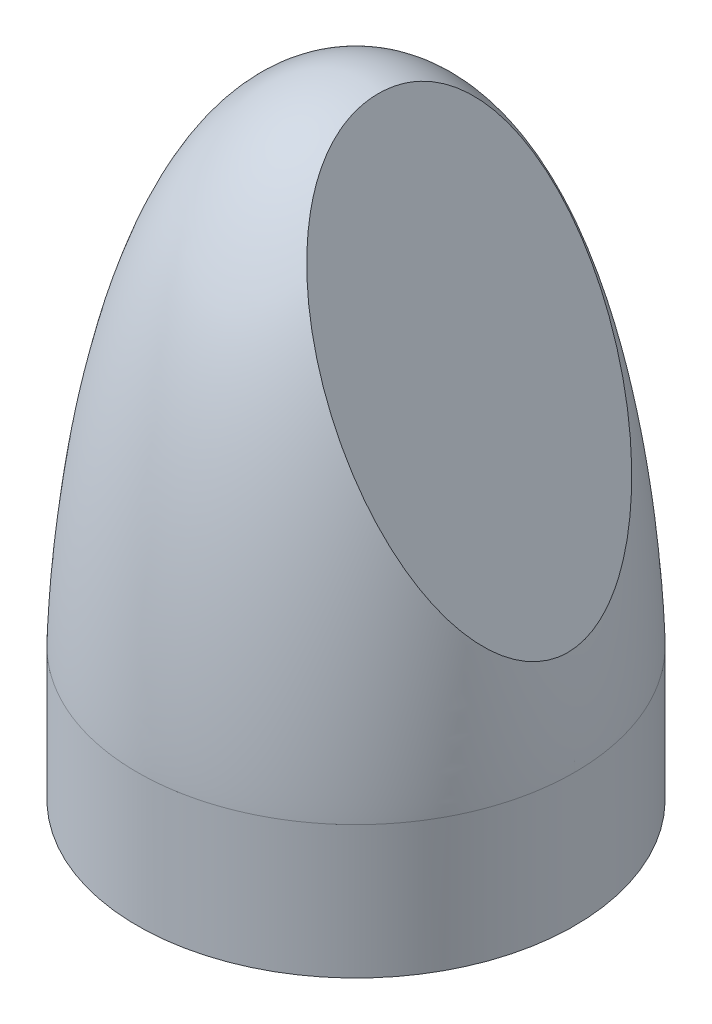
ISO-10303-21;
HEADER;
FILE_DESCRIPTION(('STEP AP214'),'2;1');
FILE_NAME('part.step','',(''),(''),'','','');
FILE_SCHEMA(('AUTOMOTIVE_DESIGN { 1 0 10303 214 1 1 1 1 }'));
ENDSEC;
DATA;
#1=APPLICATION_CONTEXT('core data for automotive mechanical design processes');
#2=APPLICATION_PROTOCOL_DEFINITION('international standard','automotive_design',2000,#1);
#3=PRODUCT_CONTEXT('',#1,'mechanical');
#4=PRODUCT('Part','Part','',(#3));
#5=PRODUCT_RELATED_PRODUCT_CATEGORY('part','',(#4));
#6=PRODUCT_DEFINITION_FORMATION('','',#4);
#7=PRODUCT_DEFINITION_CONTEXT('part definition',#1,'design');
#8=PRODUCT_DEFINITION('design','',#6,#7);
#9=PRODUCT_DEFINITION_SHAPE('','',#8);
#10=(LENGTH_UNIT() NAMED_UNIT(*) SI_UNIT(.MILLI.,.METRE.));
#11=(NAMED_UNIT(*) PLANE_ANGLE_UNIT() SI_UNIT($,.RADIAN.));
#12=(NAMED_UNIT(*) SI_UNIT($,.STERADIAN.) SOLID_ANGLE_UNIT());
#13=UNCERTAINTY_MEASURE_WITH_UNIT(LENGTH_MEASURE(1.E-05),#10,'distance_accuracy_value','');
#14=(GEOMETRIC_REPRESENTATION_CONTEXT(3) GLOBAL_UNCERTAINTY_ASSIGNED_CONTEXT((#13)) GLOBAL_UNIT_ASSIGNED_CONTEXT((#10,
#11,#12)) REPRESENTATION_CONTEXT('',''));
#15=CARTESIAN_POINT('',(0.,0.,0.));
#16=DIRECTION('',(0.,0.,1.));
#17=DIRECTION('',(1.,0.,0.));
#18=AXIS2_PLACEMENT_3D('',#15,#16,#17);
#19=CARTESIAN_POINT('',(0.,-7.91303002861502,1.63207319706783E-06));
#20=DIRECTION('',(0.,-1.,0.));
#21=DIRECTION('',(0.,0.,-1.));
#22=AXIS2_PLACEMENT_3D('',#19,#20,#21);
#23=PLANE('',#22);
#24=CARTESIAN_POINT('',(0.,-7.91303002861502,1.63207319706783E-06));
#25=DIRECTION('',(0.,-1.,0.));
#26=DIRECTION('',(0.,0.,-1.));
#27=AXIS2_PLACEMENT_3D('',#24,#25,#26);
#28=CIRCLE('',#27,14.);
#29=CARTESIAN_POINT('',(0.,-7.91303002861502,-13.9999983679268));
#30=VERTEX_POINT('',#29);
#31=EDGE_CURVE('E45',#30,#30,#28,.T.);
#32=ORIENTED_EDGE('',*,*,#31,.T.);
#33=EDGE_LOOP('',(#32));
#34=FACE_BOUND('',#33,.T.);
#35=ADVANCED_FACE('F35',(#34),#23,.T.);
#36=CARTESIAN_POINT('',(0.,-7.91303002861502,1.63207319706783E-06));
#37=DIRECTION('',(0.,-1.,0.));
#38=DIRECTION('',(0.,0.,-1.));
#39=AXIS2_PLACEMENT_3D('',#36,#37,#38);
#40=CYLINDRICAL_SURFACE('',#39,14.);
#41=CARTESIAN_POINT('',(0.,0.599554023441105,1.63207319706783E-06));
#42=DIRECTION('',(0.,-1.,0.));
#43=DIRECTION('',(0.,0.,-1.));
#44=AXIS2_PLACEMENT_3D('',#41,#42,#43);
#45=CIRCLE('',#44,14.);
#46=CARTESIAN_POINT('',(0.,0.599554023441105,-13.9999983679268));
#47=VERTEX_POINT('',#46);
#48=EDGE_CURVE('E56',#47,#47,#45,.T.);
#49=ORIENTED_EDGE('',*,*,#48,.T.);
#50=EDGE_LOOP('',(#49));
#51=FACE_BOUND('',#50,.T.);
#52=ORIENTED_EDGE('',*,*,#31,.F.);
#53=EDGE_LOOP('',(#52));
#54=FACE_BOUND('',#53,.T.);
#55=ADVANCED_FACE('F52',(#51,#54),#40,.T.);
#56=CARTESIAN_POINT('',(14.,0.599554023441091,1.63207319706783E-06));
#57=CARTESIAN_POINT('',(14.0101192378029,0.600297963765106,1.63207319706783E-06));
#58=CARTESIAN_POINT('',(13.497519718667,32.0535501950033,1.63207319706783E-06));
#59=CARTESIAN_POINT('',(0.,32.086969971385,1.63207319706783E-06));
#60=B_SPLINE_CURVE_WITH_KNOTS('',3,(#56,#57,#58,#59),.UNSPECIFIED.,.F.,.F.,(4,4),(0.,
0.166417438268429),.UNSPECIFIED.);
#61=CARTESIAN_POINT('',(0.,-7.91303002861502,1.63207319706783E-06));
#62=DIRECTION('',(0.,-1.,0.));
#63=AXIS1_PLACEMENT('',#61,#62);
#64=SURFACE_OF_REVOLUTION('',#60,#63);
#65=CARTESIAN_POINT('',(13.5695925705618,7.03495349548713,1.63207319706783E-06));
#66=CARTESIAN_POINT('',(13.569593111081,7.03495238615009,-0.115935962691736));
#67=CARTESIAN_POINT('',(13.5677017376389,7.03883415783024,-0.231863789741345));
#68=CARTESIAN_POINT('',(13.5601689966265,7.05429402421619,-0.463113613480936));
#69=CARTESIAN_POINT('',(13.554526715549,7.06587399376377,-0.57843545569004));
#70=CARTESIAN_POINT('',(13.5395854771663,7.09653873433856,-0.807815068448769));
#71=CARTESIAN_POINT('',(13.5302870646289,7.11562238730826,-0.921873024716839));
#72=CARTESIAN_POINT('',(13.5081808067805,7.16099229873516,-1.14820576316821));
#73=CARTESIAN_POINT('',(13.4953725740684,7.18727935227742,-1.26048034706125));
#74=CARTESIAN_POINT('',(13.4641002184667,7.25146135962925,-1.50069596285211));
#75=CARTESIAN_POINT('',(13.445057217935,7.290544376454,-1.62824524834484));
#76=CARTESIAN_POINT('',(13.4028369903689,7.37719531476394,-1.87970464842254));
#77=CARTESIAN_POINT('',(13.3796594396676,7.4247639005289,-2.00361447721312));
#78=CARTESIAN_POINT('',(13.3044455699655,7.57912953897566,-2.36935766905935));
#79=CARTESIAN_POINT('',(13.246734797026,7.69757259137201,-2.60515453007807));
#80=CARTESIAN_POINT('',(13.0792809463252,8.04124751032234,-3.20033229330516));
#81=CARTESIAN_POINT('',(12.9595386182557,8.28700139846505,-3.54503548701057));
#82=CARTESIAN_POINT('',(12.7636289989305,8.68907768552191,-4.02670415129678));
#83=CARTESIAN_POINT('',(12.6954726018878,8.82895887745364,-4.18160892362818));
#84=CARTESIAN_POINT('',(12.5545870920375,9.11810610205571,-4.48024095883491));
#85=CARTESIAN_POINT('',(12.4818581996817,9.26737168228025,-4.62396875983492));
#86=CARTESIAN_POINT('',(12.2844743172951,9.67247368200985,-4.99014958880977));
#87=CARTESIAN_POINT('',(12.1565984209263,9.93492054803463,-5.20354939246708));
#88=CARTESIAN_POINT('',(11.8932504340534,10.4754043748651,-5.60440398331515));
#89=CARTESIAN_POINT('',(11.7577734255069,10.7534514292443,-5.79184169415517));
#90=CARTESIAN_POINT('',(11.4809120363106,11.3216695687154,-6.14336078578195));
#91=CARTESIAN_POINT('',(11.3395195596337,11.6118572697371,-6.30740870595594));
#92=CARTESIAN_POINT('',(11.0523536226196,12.2012240099798,-6.61387427767249));
#93=CARTESIAN_POINT('',(10.9065806627114,12.5004020221419,-6.75629438882122));
#94=CARTESIAN_POINT('',(10.6372145804181,13.0532371233513,-6.99819389175374));
#95=CARTESIAN_POINT('',(10.5141615078226,13.3057858379604,-7.10083629662205));
#96=CARTESIAN_POINT('',(10.266126712572,13.8148415437434,-7.2932553568146));
#97=CARTESIAN_POINT('',(10.1411447494743,14.0713490283912,-7.38303039359384));
#98=CARTESIAN_POINT('',(9.88955921589693,14.5876921133629,-7.55034430684583));
#99=CARTESIAN_POINT('',(9.76295491160109,14.8475292197389,-7.62787741847709));
#100=CARTESIAN_POINT('',(9.50846584128399,15.3698313958245,-7.77113080345647));
#101=CARTESIAN_POINT('',(9.38058093973396,15.6322967436874,-7.83684981223705));
#102=CARTESIAN_POINT('',(8.99480154315081,16.4240534115604,-8.01711777693927));
#103=CARTESIAN_POINT('',(8.73532783324459,16.9565858427259,-8.11441970486723));
#104=CARTESIAN_POINT('',(8.21402709922825,18.0264805436358,-8.26468524020296));
#105=CARTESIAN_POINT('',(7.9522006932991,18.5638415446527,-8.31766016917724));
#106=CARTESIAN_POINT('',(7.50750902556991,19.4765071670022,-8.3699952668589));
#107=CARTESIAN_POINT('',(7.3248886181778,19.851309259916,-8.38077243905584));
#108=CARTESIAN_POINT('',(6.95961564994763,20.600979436062,-8.38055717645193));
#109=CARTESIAN_POINT('',(6.77696308799601,20.9758475215797,-8.36956194015509));
#110=CARTESIAN_POINT('',(6.41209728568607,21.7246820482973,-8.32505448639336));
#111=CARTESIAN_POINT('',(6.2298842785092,22.0986480109258,-8.29153219449331));
#112=CARTESIAN_POINT('',(5.86728178438736,22.8428374234531,-8.20100542017854));
#113=CARTESIAN_POINT('',(5.68688796714474,23.2130697606643,-8.14409244609434));
#114=CARTESIAN_POINT('',(5.32801042257246,23.9496142505506,-8.00526690446767));
#115=CARTESIAN_POINT('',(5.14952600360483,24.3159278227131,-7.92336372996598));
#116=CARTESIAN_POINT('',(4.79546508716638,25.0425868768416,-7.73257352089771));
#117=CARTESIAN_POINT('',(4.61988621207603,25.4029372385294,-7.62370984497012));
#118=CARTESIAN_POINT('',(4.32539240445965,26.0073433781334,-7.41386222117222));
#119=CARTESIAN_POINT('',(4.20543298191147,26.2535428214368,-7.32049117738945));
#120=CARTESIAN_POINT('',(3.96803166737841,26.7407748390308,-7.11829744784054));
#121=CARTESIAN_POINT('',(3.8505895611237,26.9818078530792,-7.00947608323993));
#122=CARTESIAN_POINT('',(3.61893639897148,27.4572426155169,-6.77520540763167));
#123=CARTESIAN_POINT('',(3.50472486699324,27.6916453409934,-6.64975856232959));
#124=CARTESIAN_POINT('',(3.28041196295403,28.1520152804874,-6.38092333942188));
#125=CARTESIAN_POINT('',(3.17031008170108,28.3779835395481,-6.23753719416755));
#126=CARTESIAN_POINT('',(2.97233370093599,28.7843015568928,-5.95566371149793));
#127=CARTESIAN_POINT('',(2.88369496884013,28.9662197925226,-5.81997899186252));
#128=CARTESIAN_POINT('',(2.71097024865626,29.3207124121993,-5.53417658929666));
#129=CARTESIAN_POINT('',(2.62688431465721,29.4932866852365,-5.3840587349539));
#130=CARTESIAN_POINT('',(2.46439058944298,29.8267816607728,-5.06903302195973));
#131=CARTESIAN_POINT('',(2.38597475201658,29.9877188769619,-4.90414689556671));
#132=CARTESIAN_POINT('',(2.23585880587704,30.295810243071,-4.55912921760212));
#133=CARTESIAN_POINT('',(2.16415669826374,30.4429684954458,-4.37900223433969));
#134=CARTESIAN_POINT('',(2.04407670479046,30.6894153932135,-4.04623563313655));
#135=CARTESIAN_POINT('',(1.99409396407966,30.7919977721245,-3.89660869369195));
#136=CARTESIAN_POINT('',(1.89950679623883,30.9861243156789,-3.58873506093898));
#137=CARTESIAN_POINT('',(1.85490163983911,31.0776699770434,-3.43048954065627));
#138=CARTESIAN_POINT('',(1.77167157698174,31.2484876977887,-3.10613254633115));
#139=CARTESIAN_POINT('',(1.73304254743913,31.3277682192077,-2.94002659965607));
#140=CARTESIAN_POINT('',(1.6622250457882,31.4731109452082,-2.60077902038431));
#141=CARTESIAN_POINT('',(1.63003697730049,31.5391723214165,-2.42763694768865));
#142=CARTESIAN_POINT('',(1.57239630370753,31.6574715049969,-2.07499721271673));
#143=CARTESIAN_POINT('',(1.5469645056908,31.7096666088155,-1.89548180369488));
#144=CARTESIAN_POINT('',(1.50319858550568,31.7994898586808,-1.53204197155543));
#145=CARTESIAN_POINT('',(1.48486287171623,31.8371212713005,-1.34811854697623));
#146=CARTESIAN_POINT('',(1.4553448581792,31.8977027441508,-0.977183425601441));
#147=CARTESIAN_POINT('',(1.44416738569824,31.9206428971117,-0.790169731837354));
#148=CARTESIAN_POINT('',(1.42895044362931,31.9518734798085,-0.414434108559467));
#149=CARTESIAN_POINT('',(1.42491874127721,31.9601479684111,-0.225710544068186));
#150=CARTESIAN_POINT('',(1.42400690458217,31.9620193819436,0.143930900312275));
#151=CARTESIAN_POINT('',(1.42683495728801,31.9562152109413,0.324845403956373));
#152=CARTESIAN_POINT('',(1.43906204675914,31.9311208702295,0.685594032731897));
#153=CARTESIAN_POINT('',(1.44846373484193,31.9118252590726,0.865427692403453));
#154=CARTESIAN_POINT('',(1.47386751976268,31.8596876481002,1.22259303149525));
#155=CARTESIAN_POINT('',(1.48986741936465,31.8268501577952,1.39992552350496));
#156=CARTESIAN_POINT('',(1.52841999257066,31.747726551999,1.75075483186491));
#157=CARTESIAN_POINT('',(1.55096965696794,31.7014466124715,1.92425337037416));
#158=CARTESIAN_POINT('',(1.60251080753621,31.5956658217043,2.26655146825602));
#159=CARTESIAN_POINT('',(1.63151431501456,31.536140298462,2.43534158843063));
#160=CARTESIAN_POINT('',(1.69561194785318,31.4045891356878,2.76659689286819));
#161=CARTESIAN_POINT('',(1.73070079466112,31.3325743296244,2.92906741057632));
#162=CARTESIAN_POINT('',(1.80660384093532,31.1767942554895,3.24703533186243));
#163=CARTESIAN_POINT('',(1.8474225594887,31.0930197126422,3.40252710238237));
#164=CARTESIAN_POINT('',(1.9342792128042,30.9147589371296,3.7057561851056));
#165=CARTESIAN_POINT('',(1.98031889289173,30.8202691224352,3.85349087989193));
#166=CARTESIAN_POINT('',(2.09137058659041,30.5923515100814,4.18314937232851));
#167=CARTESIAN_POINT('',(2.1579714171975,30.455662894292,4.36229317581793));
#168=CARTESIAN_POINT('',(2.29784576848922,30.1685909270472,4.70635476095048));
#169=CARTESIAN_POINT('',(2.37112079142655,30.0182044924345,4.8712693234749));
#170=CARTESIAN_POINT('',(2.59957135235512,29.5493426079053,5.34532503044854));
#171=CARTESIAN_POINT('',(2.7632364540971,29.2134435506978,5.63338815709374));
#172=CARTESIAN_POINT('',(3.06335253823984,28.5974984980057,6.09218704505054));
#173=CARTESIAN_POINT('',(3.19657895696239,28.3240704552054,6.27434608299585));
#174=CARTESIAN_POINT('',(3.46954956358874,27.7638375867734,6.61153737880839));
#175=CARTESIAN_POINT('',(3.60929705867246,27.477025973631,6.76655567858261));
#176=CARTESIAN_POINT('',(3.89375799365458,26.8932108605993,7.0519015053211));
#177=CARTESIAN_POINT('',(4.03847903035531,26.596191769367,7.18218907978723));
#178=CARTESIAN_POINT('',(4.33144124331907,25.9949290072721,7.41996343650344));
#179=CARTESIAN_POINT('',(4.47968223138939,25.690685722648,7.52745143468478));
#180=CARTESIAN_POINT('',(4.74953643860886,25.1368488153067,7.70252116722886));
#181=CARTESIAN_POINT('',(4.8706956287262,24.8881870218073,7.77379676397444));
#182=CARTESIAN_POINT('',(5.1143235547424,24.3881757806371,7.90359441569345));
#183=CARTESIAN_POINT('',(5.2367924458304,24.1368260144631,7.96211494132658));
#184=CARTESIAN_POINT('',(5.60577897053224,23.3795342983281,8.11964016622769));
#185=CARTESIAN_POINT('',(5.85380816803834,22.8704900811097,8.20056527427735));
#186=CARTESIAN_POINT('',(6.3522920829253,21.8474236163507,8.31844954376962));
#187=CARTESIAN_POINT('',(6.6027507181833,21.3333933279313,8.35531861474772));
#188=CARTESIAN_POINT('',(7.10411240815579,20.3044206441446,8.38740792799201));
#189=CARTESIAN_POINT('',(7.35501534963813,19.7894784811699,8.38263758108016));
#190=CARTESIAN_POINT('',(7.86820809565897,18.7362242582516,8.33154894644731));
#191=CARTESIAN_POINT('',(8.13045916712688,18.1979916923587,8.28322423973561));
#192=CARTESIAN_POINT('',(8.65278910521417,17.1259846982756,8.14224487167148));
#193=CARTESIAN_POINT('',(8.91286730109274,16.5922116466843,8.04957700171914));
#194=CARTESIAN_POINT('',(9.29961079452184,15.7984763088434,7.8764022991751));
#195=CARTESIAN_POINT('',(9.42778886701671,15.5354092698263,7.81309245066583));
#196=CARTESIAN_POINT('',(9.68291880517343,15.0117918047705,7.6747310952471));
#197=CARTESIAN_POINT('',(9.80987080234767,14.7512411088216,7.59968086283597));
#198=CARTESIAN_POINT('',(10.0621937686621,14.2333845493308,7.43744414210311));
#199=CARTESIAN_POINT('',(10.1875656885015,13.9760767346159,7.3502653727918));
#200=CARTESIAN_POINT('',(10.4364851752332,13.4652053269437,7.16315043942667));
#201=CARTESIAN_POINT('',(10.5600326245051,13.2116419753856,7.0632134568438));
#202=CARTESIAN_POINT('',(10.8040661526837,12.7107982941748,6.85057826620381));
#203=CARTESIAN_POINT('',(10.92456715733,12.4634873315906,6.73796965042831));
#204=CARTESIAN_POINT('',(11.1628254349411,11.9744965206626,6.49861874455362));
#205=CARTESIAN_POINT('',(11.2805833119411,11.7328154326234,6.37187960224371));
#206=CARTESIAN_POINT('',(11.5128018208414,11.2562203773825,6.1031370649898));
#207=CARTESIAN_POINT('',(11.6272606786049,11.0213100513411,5.96112564425124));
#208=CARTESIAN_POINT('',(11.8519750623534,10.560116132548,5.66067443128469));
#209=CARTESIAN_POINT('',(11.9622311237976,10.3338314408431,5.50223674148624));
#210=CARTESIAN_POINT('',(12.1605913108195,9.92672571641578,5.19372675425537));
#211=CARTESIAN_POINT('',(12.2494613104783,9.74433283741064,5.04622738554583));
#212=CARTESIAN_POINT('',(12.4225816229001,9.38902832162186,4.7375908912396));
#213=CARTESIAN_POINT('',(12.5068313307808,9.21611792627239,4.5764519869635));
#214=CARTESIAN_POINT('',(12.6694427131064,8.88238147645509,4.23993495336355));
#215=CARTESIAN_POINT('',(12.7478153519104,8.7215329192187,4.06458467704947));
#216=CARTESIAN_POINT('',(12.8973860850233,8.41456052434844,3.69876743748846));
#217=CARTESIAN_POINT('',(12.9685883297078,8.26842816866593,3.5083093344417));
#218=CARTESIAN_POINT('',(13.1200427664086,7.95758974339257,3.0584135627423));
#219=CARTESIAN_POINT('',(13.1976275609072,7.79835812316113,2.79414473234098));
#220=CARTESIAN_POINT('',(13.2999280962746,7.58840100331087,2.37992786858826));
#221=CARTESIAN_POINT('',(13.3316784206356,7.52323803389727,2.23890935830274));
#222=CARTESIAN_POINT('',(13.3899211837091,7.40370314834548,1.95127658335797));
#223=CARTESIAN_POINT('',(13.4164142190157,7.34933000778398,1.8046629558832));
#224=CARTESIAN_POINT('',(13.4609372672647,7.25795286157722,1.52307037300803));
#225=CARTESIAN_POINT('',(13.4795788535589,7.21969368968032,1.38859514756734));
#226=CARTESIAN_POINT('',(13.5118472849967,7.15346738008702,1.1165488122648));
#227=CARTESIAN_POINT('',(13.5254750345172,7.12549838628728,0.978978265480491));
#228=CARTESIAN_POINT('',(13.5474031260014,7.0804941356726,0.701736180914162));
#229=CARTESIAN_POINT('',(13.5557073238617,7.06345096518501,0.562066238959865));
#230=CARTESIAN_POINT('',(13.5668013644393,7.0406820441885,0.281593175660219));
#231=CARTESIAN_POINT('',(13.5695919141836,7.0349548426082,0.140790201931328));
#232=CARTESIAN_POINT('',(13.5695925705618,7.03495349548713,1.63207319706783E-06));
#233=B_SPLINE_CURVE_WITH_KNOTS('',3,(#65,#66,#67,#68,#69,#70,#71,#72,#73,#74,#75,#76,#77,#78,
#79,#80,#81,#82,#83,#84,#85,#86,#87,#88,#89,#90,#91,#92,#93,#94,#95,#96,#97,#98,#99,#100,#101,
#102,#103,#104,#105,#106,#107,#108,#109,#110,#111,#112,#113,#114,#115,#116,#117,#118,#119,#120,
#121,#122,#123,#124,#125,#126,#127,#128,#129,#130,#131,#132,#133,#134,#135,#136,#137,#138,#139,
#140,#141,#142,#143,#144,#145,#146,#147,#148,#149,#150,#151,#152,#153,#154,#155,#156,#157,#158,
#159,#160,#161,#162,#163,#164,#165,#166,#167,#168,#169,#170,#171,#172,#173,#174,#175,#176,#177,
#178,#179,#180,#181,#182,#183,#184,#185,#186,#187,#188,#189,#190,#191,#192,#193,#194,#195,#196,
#197,#198,#199,#200,#201,#202,#203,#204,#205,#206,#207,#208,#209,#210,#211,#212,#213,#214,#215,
#216,#217,#218,#219,#220,#221,#222,#223,#224,#225,#226,#227,#228,#229,#230,#231,#232),
.UNSPECIFIED.,.T.,.F.,(4,2,2,2,2,2,2,2,2,2,2,2,2,2,2,2,2,2,2,2,2,2,2,2,2,2,2,2,2,2,2,2,2,2,2,2,
2,2,2,2,2,2,2,2,2,2,2,2,2,2,2,2,2,2,2,2,2,2,2,2,2,2,2,2,2,2,2,2,2,2,2,2,2,2,2,2,2,2,2,2,2,2,2,
4),(0.,0.347716159295487,0.695517033447526,1.04326610449338,1.39105357428383,1.79489885053381,
2.19877575507835,3.00668561334551,4.31863896660072,4.97698506260486,5.63529944233445,
6.71845257087879,7.80231478519259,8.88771230315853,9.9729862925272,10.869959226273,
11.7670448885374,12.6645517452688,13.5621546129397,15.361236622299,17.1598589874283,
18.4105347677635,19.6613714853184,20.9127679683081,22.1593146846205,23.4053934386869,
24.6503963412783,25.5180391595039,26.3856078297446,27.2530479755795,28.1203802850605,
28.8507355379243,29.5810994657818,30.3104057509034,31.0394942022567,31.6034758257574,
32.1673808798473,32.7308951293137,33.2944446801544,33.8597101705905,34.4248488008347,
34.9903681405291,35.5565018065167,36.0989775852064,36.6416722847401,37.184186410088,
37.7264516773611,38.2697355829064,38.8125505682474,39.3557960966384,39.8992237659745,
40.6030565974783,41.3070482437074,42.7165081976705,43.7788479284005,44.8417324105679,
45.9063196353858,46.9708500700895,47.827470522614,48.6841936279862,50.3981235060452,
52.1155522446967,53.8325928415745,55.6330171013461,57.4339779917843,58.3319896268071,
59.2299038441365,60.1272491907471,61.0246521373281,61.9160675712029,62.8072848240269,
63.6989727339226,64.5905466555466,65.3425542907281,66.0946601438667,66.8453260200137,
67.5955548668726,68.5462965756788,69.0215234510275,69.4966963670369,69.919381622714,
70.3419905986029,70.7642931281065,71.18654150132),.UNSPECIFIED.);
#234=CARTESIAN_POINT('',(13.5695925705618,7.03495349548713,1.63207319706783E-06));
#235=VERTEX_POINT('',#234);
#236=EDGE_CURVE('E11',#235,#235,#233,.T.);
#237=ORIENTED_EDGE('',*,*,#236,.F.);
#238=EDGE_LOOP('',(#237));
#239=FACE_BOUND('',#238,.T.);
#240=CARTESIAN_POINT('',(0.,32.086969971385,1.63207319706783E-06));
#241=VERTEX_POINT('',#240);
#242=VERTEX_LOOP('',#241);
#243=FACE_BOUND('',#242,.T.);
#244=ORIENTED_EDGE('',*,*,#48,.F.);
#245=EDGE_LOOP('',(#244));
#246=FACE_BOUND('',#245,.T.);
#247=ADVANCED_FACE('F48',(#239,#243,#246),#64,.F.);
#248=CARTESIAN_POINT('',(1.42440752605615,31.9611971640488,-14.0050579868282));
#249=DIRECTION('',(-0.898966715538194,-0.438016945282341,0.));
#250=DIRECTION('',(0.438016945282341,-0.898966715538194,0.));
#251=AXIS2_PLACEMENT_3D('',#248,#249,#250);
#252=PLANE('',#251);
#253=ORIENTED_EDGE('',*,*,#236,.T.);
#254=EDGE_LOOP('',(#253));
#255=FACE_BOUND('',#254,.T.);
#256=ADVANCED_FACE('F51',(#255),#252,.F.);
#257=CLOSED_SHELL('',(#35,#55,#247,#256));
#258=MANIFOLD_SOLID_BREP('B2',#257);
#259=ADVANCED_BREP_SHAPE_REPRESENTATION('',(#18,#258),#14);
#260=SHAPE_DEFINITION_REPRESENTATION(#9,#259);
ENDSEC;
END-ISO-10303-21;
